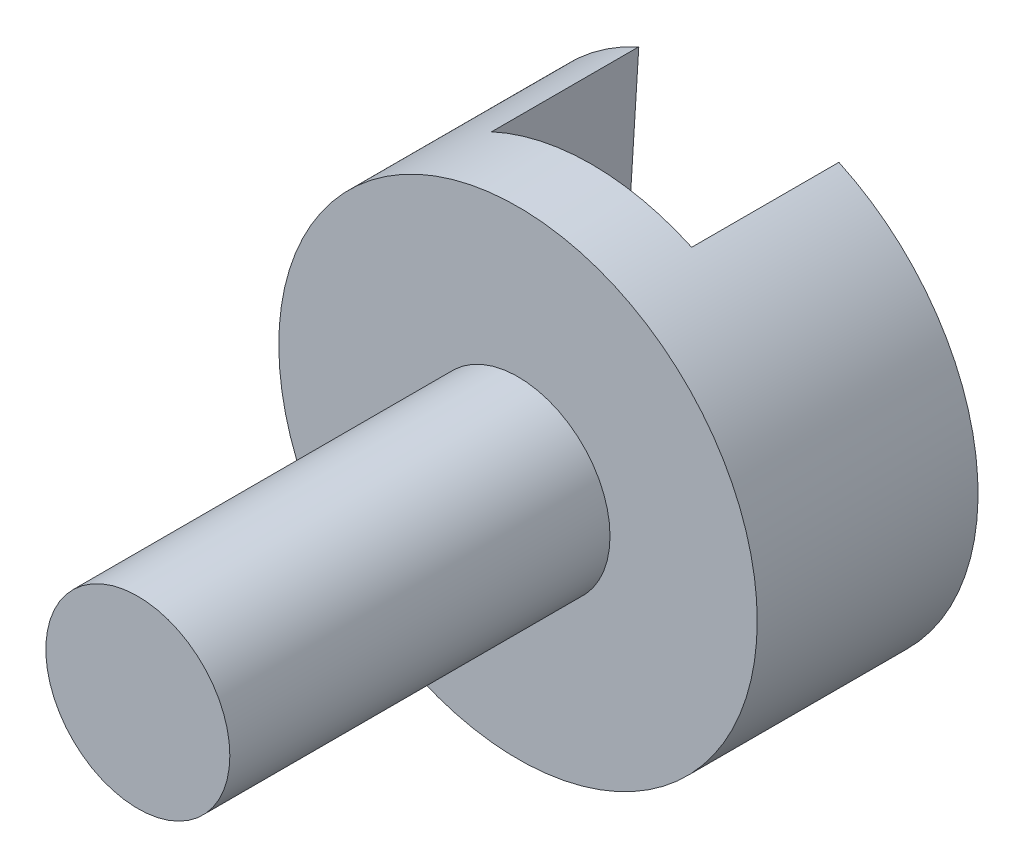
ISO-10303-21;
HEADER;
FILE_DESCRIPTION(('STEP AP214'),'2;1');
FILE_NAME('part.step','',(''),(''),'','','');
FILE_SCHEMA(('AUTOMOTIVE_DESIGN { 1 0 10303 214 1 1 1 1 }'));
ENDSEC;
DATA;
#1=APPLICATION_CONTEXT('core data for automotive mechanical design processes');
#2=APPLICATION_PROTOCOL_DEFINITION('international standard','automotive_design',2000,#1);
#3=PRODUCT_CONTEXT('',#1,'mechanical');
#4=PRODUCT('Part','Part','',(#3));
#5=PRODUCT_RELATED_PRODUCT_CATEGORY('part','',(#4));
#6=PRODUCT_DEFINITION_FORMATION('','',#4);
#7=PRODUCT_DEFINITION_CONTEXT('part definition',#1,'design');
#8=PRODUCT_DEFINITION('design','',#6,#7);
#9=PRODUCT_DEFINITION_SHAPE('','',#8);
#10=(LENGTH_UNIT() NAMED_UNIT(*) SI_UNIT(.MILLI.,.METRE.));
#11=(NAMED_UNIT(*) PLANE_ANGLE_UNIT() SI_UNIT($,.RADIAN.));
#12=(NAMED_UNIT(*) SI_UNIT($,.STERADIAN.) SOLID_ANGLE_UNIT());
#13=UNCERTAINTY_MEASURE_WITH_UNIT(LENGTH_MEASURE(1.E-05),#10,'distance_accuracy_value','');
#14=(GEOMETRIC_REPRESENTATION_CONTEXT(3) GLOBAL_UNCERTAINTY_ASSIGNED_CONTEXT((#13)) GLOBAL_UNIT_ASSIGNED_CONTEXT((#10,
#11,#12)) REPRESENTATION_CONTEXT('',''));
#15=CARTESIAN_POINT('',(0.,0.,0.));
#16=DIRECTION('',(0.,0.,1.));
#17=DIRECTION('',(1.,0.,0.));
#18=AXIS2_PLACEMENT_3D('',#15,#16,#17);
#19=CARTESIAN_POINT('',(0.,0.,6.));
#20=DIRECTION('',(0.,0.,-1.));
#21=DIRECTION('',(-1.,0.,0.));
#22=AXIS2_PLACEMENT_3D('',#19,#20,#21);
#23=CYLINDRICAL_SURFACE('',#22,6.5);
#24=CARTESIAN_POINT('',(0.,0.,6.));
#25=DIRECTION('',(0.,0.,1.));
#26=DIRECTION('',(1.,0.,0.));
#27=AXIS2_PLACEMENT_3D('',#24,#25,#26);
#28=CIRCLE('',#27,6.5);
#29=CARTESIAN_POINT('',(6.5,0.,6.));
#30=VERTEX_POINT('',#29);
#31=EDGE_CURVE('E48',#30,#30,#28,.T.);
#32=ORIENTED_EDGE('',*,*,#31,.F.);
#33=EDGE_LOOP('',(#32));
#34=FACE_BOUND('',#33,.T.);
#35=DIRECTION('',(0.,0.,-1.));
#36=VECTOR('',#35,1.);
#37=CARTESIAN_POINT('',(-2.71841021920876,5.9042565899613,4.));
#38=LINE('',#37,#36);
#39=CARTESIAN_POINT('',(-2.71841021920876,5.9042565899613,4.));
#40=VERTEX_POINT('',#39);
#41=CARTESIAN_POINT('',(-2.71841021920876,5.9042565899613,0.));
#42=VERTEX_POINT('',#41);
#43=EDGE_CURVE('E92',#40,#42,#38,.T.);
#44=ORIENTED_EDGE('',*,*,#43,.T.);
#45=CARTESIAN_POINT('',(0.,0.,0.));
#46=DIRECTION('',(0.,0.,1.));
#47=DIRECTION('',(1.,0.,0.));
#48=AXIS2_PLACEMENT_3D('',#45,#46,#47);
#49=CIRCLE('',#48,6.5);
#50=CARTESIAN_POINT('',(2.71841021920876,5.9042565899613,0.));
#51=VERTEX_POINT('',#50);
#52=EDGE_CURVE('E42',#42,#51,#49,.T.);
#53=ORIENTED_EDGE('',*,*,#52,.T.);
#54=DIRECTION('',(0.,0.,-1.));
#55=VECTOR('',#54,1.);
#56=CARTESIAN_POINT('',(2.71841021920876,5.9042565899613,4.));
#57=LINE('',#56,#55);
#58=CARTESIAN_POINT('',(2.71841021920876,5.9042565899613,4.));
#59=VERTEX_POINT('',#58);
#60=EDGE_CURVE('E56',#59,#51,#57,.T.);
#61=ORIENTED_EDGE('',*,*,#60,.F.);
#62=CARTESIAN_POINT('',(0.,0.,4.));
#63=DIRECTION('',(0.,0.,1.));
#64=DIRECTION('',(1.,0.,0.));
#65=AXIS2_PLACEMENT_3D('',#62,#63,#64);
#66=CIRCLE('',#65,6.5);
#67=EDGE_CURVE('E96',#59,#40,#66,.T.);
#68=ORIENTED_EDGE('',*,*,#67,.T.);
#69=EDGE_LOOP('',(#44,#53,#61,#68));
#70=FACE_BOUND('',#69,.T.);
#71=ADVANCED_FACE('F39',(#34,#70),#23,.T.);
#72=CARTESIAN_POINT('',(0.,0.,0.));
#73=DIRECTION('',(0.,0.,1.));
#74=DIRECTION('',(1.,0.,0.));
#75=AXIS2_PLACEMENT_3D('',#72,#73,#74);
#76=PLANE('',#75);
#77=DIRECTION('',(-0.0619195531093016,-0.998081143466174,0.));
#78=VECTOR('',#77,1.);
#79=CARTESIAN_POINT('',(-2.94581033267736,2.23879464978174,0.));
#80=LINE('',#79,#78);
#81=CARTESIAN_POINT('',(-2.94581033267736,2.23879464978174,0.));
#82=VERTEX_POINT('',#81);
#83=EDGE_CURVE('E111',#42,#82,#80,.T.);
#84=ORIENTED_EDGE('',*,*,#83,.T.);
#85=CARTESIAN_POINT('',(0.,0.,0.));
#86=DIRECTION('',(0.,0.,1.));
#87=DIRECTION('',(1.,0.,0.));
#88=AXIS2_PLACEMENT_3D('',#85,#86,#87);
#89=CIRCLE('',#88,3.7);
#90=CARTESIAN_POINT('',(2.94581033267735,2.23879464978174,0.));
#91=VERTEX_POINT('',#90);
#92=EDGE_CURVE('E100',#82,#91,#89,.T.);
#93=ORIENTED_EDGE('',*,*,#92,.T.);
#94=DIRECTION('',(-0.0619195531093016,0.998081143466174,0.));
#95=VECTOR('',#94,1.);
#96=CARTESIAN_POINT('',(2.94581033267736,2.23879464978174,0.));
#97=LINE('',#96,#95);
#98=EDGE_CURVE('E117',#91,#51,#97,.T.);
#99=ORIENTED_EDGE('',*,*,#98,.T.);
#100=ORIENTED_EDGE('',*,*,#52,.F.);
#101=EDGE_LOOP('',(#84,#93,#99,#100));
#102=FACE_BOUND('',#101,.T.);
#103=ADVANCED_FACE('F134',(#102),#76,.F.);
#104=CARTESIAN_POINT('',(0.,0.,6.));
#105=DIRECTION('',(0.,0.,1.));
#106=DIRECTION('',(1.,0.,0.));
#107=AXIS2_PLACEMENT_3D('',#104,#105,#106);
#108=PLANE('',#107);
#109=CARTESIAN_POINT('',(0.,0.,6.));
#110=DIRECTION('',(0.,0.,1.));
#111=DIRECTION('',(1.,0.,0.));
#112=AXIS2_PLACEMENT_3D('',#109,#110,#111);
#113=CIRCLE('',#112,2.5);
#114=CARTESIAN_POINT('',(2.5,0.,6.));
#115=VERTEX_POINT('',#114);
#116=EDGE_CURVE('E11',#115,#115,#113,.T.);
#117=ORIENTED_EDGE('',*,*,#116,.F.);
#118=EDGE_LOOP('',(#117));
#119=FACE_BOUND('',#118,.T.);
#120=ORIENTED_EDGE('',*,*,#31,.T.);
#121=EDGE_LOOP('',(#120));
#122=FACE_BOUND('',#121,.T.);
#123=ADVANCED_FACE('F150',(#119,#122),#108,.T.);
#124=CARTESIAN_POINT('',(-2.94581033267736,2.23879464978174,4.));
#125=DIRECTION('',(0.998081143466173,-0.0619195531093016,0.));
#126=DIRECTION('',(0.0619195531093016,0.998081143466173,0.));
#127=AXIS2_PLACEMENT_3D('',#124,#125,#126);
#128=PLANE('',#127);
#129=ORIENTED_EDGE('',*,*,#83,.F.);
#130=ORIENTED_EDGE('',*,*,#43,.F.);
#131=DIRECTION('',(-0.0619195531093016,-0.998081143466174,0.));
#132=VECTOR('',#131,1.);
#133=CARTESIAN_POINT('',(-2.94581033267736,2.23879464978174,4.));
#134=LINE('',#133,#132);
#135=CARTESIAN_POINT('',(-2.94581033267736,2.23879464978174,4.));
#136=VERTEX_POINT('',#135);
#137=EDGE_CURVE('E85',#40,#136,#134,.T.);
#138=ORIENTED_EDGE('',*,*,#137,.T.);
#139=DIRECTION('',(0.,0.,-1.));
#140=VECTOR('',#139,1.);
#141=CARTESIAN_POINT('',(-2.94581033267736,2.23879464978174,4.));
#142=LINE('',#141,#140);
#143=EDGE_CURVE('E90',#136,#82,#142,.T.);
#144=ORIENTED_EDGE('',*,*,#143,.T.);
#145=EDGE_LOOP('',(#129,#130,#138,#144));
#146=FACE_BOUND('',#145,.T.);
#147=ADVANCED_FACE('F89',(#146),#128,.T.);
#148=CARTESIAN_POINT('',(0.,0.,4.));
#149=DIRECTION('',(0.,0.,-1.));
#150=DIRECTION('',(-1.,0.,0.));
#151=AXIS2_PLACEMENT_3D('',#148,#149,#150);
#152=CYLINDRICAL_SURFACE('',#151,3.7);
#153=ORIENTED_EDGE('',*,*,#92,.F.);
#154=ORIENTED_EDGE('',*,*,#143,.F.);
#155=CARTESIAN_POINT('',(0.,0.,4.));
#156=DIRECTION('',(0.,0.,1.));
#157=DIRECTION('',(1.,0.,0.));
#158=AXIS2_PLACEMENT_3D('',#155,#156,#157);
#159=CIRCLE('',#158,3.7);
#160=CARTESIAN_POINT('',(2.94581033267735,2.23879464978174,4.));
#161=VERTEX_POINT('',#160);
#162=EDGE_CURVE('E95',#136,#161,#159,.T.);
#163=ORIENTED_EDGE('',*,*,#162,.T.);
#164=DIRECTION('',(0.,0.,-1.));
#165=VECTOR('',#164,1.);
#166=CARTESIAN_POINT('',(2.94581033267735,2.23879464978174,4.));
#167=LINE('',#166,#165);
#168=EDGE_CURVE('E79',#161,#91,#167,.T.);
#169=ORIENTED_EDGE('',*,*,#168,.T.);
#170=EDGE_LOOP('',(#153,#154,#163,#169));
#171=FACE_BOUND('',#170,.T.);
#172=ADVANCED_FACE('F98',(#171),#152,.F.);
#173=CARTESIAN_POINT('',(2.94581033267736,2.23879464978174,4.));
#174=DIRECTION('',(-0.998081143466173,-0.0619195531093016,0.));
#175=DIRECTION('',(0.0619195531093016,-0.998081143466173,0.));
#176=AXIS2_PLACEMENT_3D('',#173,#174,#175);
#177=PLANE('',#176);
#178=ORIENTED_EDGE('',*,*,#98,.F.);
#179=ORIENTED_EDGE('',*,*,#168,.F.);
#180=DIRECTION('',(-0.0619195531093016,0.998081143466174,0.));
#181=VECTOR('',#180,1.);
#182=CARTESIAN_POINT('',(2.94581033267736,2.23879464978174,4.));
#183=LINE('',#182,#181);
#184=EDGE_CURVE('E62',#161,#59,#183,.T.);
#185=ORIENTED_EDGE('',*,*,#184,.T.);
#186=ORIENTED_EDGE('',*,*,#60,.T.);
#187=EDGE_LOOP('',(#178,#179,#185,#186));
#188=FACE_BOUND('',#187,.T.);
#189=ADVANCED_FACE('F135',(#188),#177,.T.);
#190=CARTESIAN_POINT('',(0.,0.,4.));
#191=DIRECTION('',(0.,0.,1.));
#192=DIRECTION('',(1.,0.,0.));
#193=AXIS2_PLACEMENT_3D('',#190,#191,#192);
#194=PLANE('',#193);
#195=ORIENTED_EDGE('',*,*,#67,.F.);
#196=ORIENTED_EDGE('',*,*,#184,.F.);
#197=ORIENTED_EDGE('',*,*,#162,.F.);
#198=ORIENTED_EDGE('',*,*,#137,.F.);
#199=EDGE_LOOP('',(#195,#196,#197,#198));
#200=FACE_BOUND('',#199,.T.);
#201=ADVANCED_FACE('F104',(#200),#194,.F.);
#202=CARTESIAN_POINT('',(0.,0.,16.33));
#203=DIRECTION('',(0.,0.,-1.));
#204=DIRECTION('',(-1.,0.,0.));
#205=AXIS2_PLACEMENT_3D('',#202,#203,#204);
#206=CYLINDRICAL_SURFACE('',#205,2.5);
#207=CARTESIAN_POINT('',(0.,0.,16.33));
#208=DIRECTION('',(0.,0.,1.));
#209=DIRECTION('',(1.,0.,0.));
#210=AXIS2_PLACEMENT_3D('',#207,#208,#209);
#211=CIRCLE('',#210,2.5);
#212=CARTESIAN_POINT('',(2.5,0.,16.33));
#213=VERTEX_POINT('',#212);
#214=EDGE_CURVE('E114',#213,#213,#211,.T.);
#215=ORIENTED_EDGE('',*,*,#214,.F.);
#216=EDGE_LOOP('',(#215));
#217=FACE_BOUND('',#216,.T.);
#218=ORIENTED_EDGE('',*,*,#116,.T.);
#219=EDGE_LOOP('',(#218));
#220=FACE_BOUND('',#219,.T.);
#221=ADVANCED_FACE('F142',(#217,#220),#206,.T.);
#222=CARTESIAN_POINT('',(0.,0.,16.33));
#223=DIRECTION('',(0.,0.,1.));
#224=DIRECTION('',(1.,0.,0.));
#225=AXIS2_PLACEMENT_3D('',#222,#223,#224);
#226=PLANE('',#225);
#227=ORIENTED_EDGE('',*,*,#214,.T.);
#228=EDGE_LOOP('',(#227));
#229=FACE_BOUND('',#228,.T.);
#230=ADVANCED_FACE('F190',(#229),#226,.T.);
#231=CLOSED_SHELL('',(#71,#103,#123,#147,#172,#189,#201,#221,#230));
#232=MANIFOLD_SOLID_BREP('B2',#231);
#233=ADVANCED_BREP_SHAPE_REPRESENTATION('',(#18,#232),#14);
#234=SHAPE_DEFINITION_REPRESENTATION(#9,#233);
ENDSEC;
END-ISO-10303-21;
